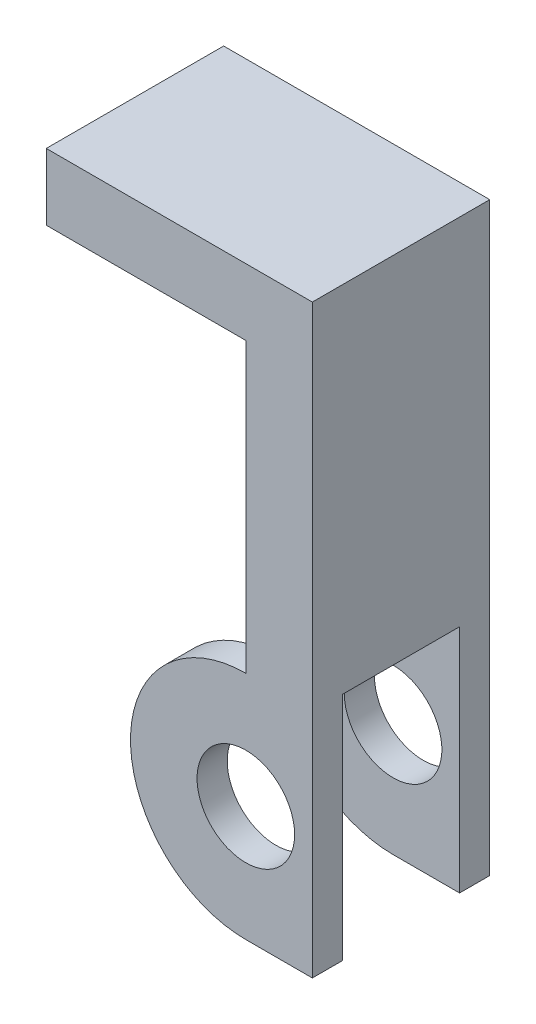
ISO-10303-21;
HEADER;
FILE_DESCRIPTION(('STEP AP214'),'2;1');
FILE_NAME('part.step','',(''),(''),'','','');
FILE_SCHEMA(('AUTOMOTIVE_DESIGN { 1 0 10303 214 1 1 1 1 }'));
ENDSEC;
DATA;
#1=APPLICATION_CONTEXT('core data for automotive mechanical design processes');
#2=APPLICATION_PROTOCOL_DEFINITION('international standard','automotive_design',2000,#1);
#3=PRODUCT_CONTEXT('',#1,'mechanical');
#4=PRODUCT('Part','Part','',(#3));
#5=PRODUCT_RELATED_PRODUCT_CATEGORY('part','',(#4));
#6=PRODUCT_DEFINITION_FORMATION('','',#4);
#7=PRODUCT_DEFINITION_CONTEXT('part definition',#1,'design');
#8=PRODUCT_DEFINITION('design','',#6,#7);
#9=PRODUCT_DEFINITION_SHAPE('','',#8);
#10=(LENGTH_UNIT() NAMED_UNIT(*) SI_UNIT(.MILLI.,.METRE.));
#11=(NAMED_UNIT(*) PLANE_ANGLE_UNIT() SI_UNIT($,.RADIAN.));
#12=(NAMED_UNIT(*) SI_UNIT($,.STERADIAN.) SOLID_ANGLE_UNIT());
#13=UNCERTAINTY_MEASURE_WITH_UNIT(LENGTH_MEASURE(1.E-05),#10,'distance_accuracy_value','');
#14=(GEOMETRIC_REPRESENTATION_CONTEXT(3) GLOBAL_UNCERTAINTY_ASSIGNED_CONTEXT((#13)) GLOBAL_UNIT_ASSIGNED_CONTEXT((#10,
#11,#12)) REPRESENTATION_CONTEXT('',''));
#15=CARTESIAN_POINT('',(0.,0.,0.));
#16=DIRECTION('',(0.,0.,1.));
#17=DIRECTION('',(1.,0.,0.));
#18=AXIS2_PLACEMENT_3D('',#15,#16,#17);
#19=CARTESIAN_POINT('',(-4.7625,-8.255,12.7));
#20=DIRECTION('',(0.,0.,-1.));
#21=DIRECTION('',(-1.,0.,0.));
#22=AXIS2_PLACEMENT_3D('',#19,#20,#21);
#23=CYLINDRICAL_SURFACE('',#22,8.255);
#24=DIRECTION('',(0.,0.,-1.));
#25=VECTOR('',#24,1.);
#26=CARTESIAN_POINT('',(-4.7625,-16.51,12.7));
#27=LINE('',#26,#25);
#28=CARTESIAN_POINT('',(-4.7625,-16.51,2.159));
#29=VERTEX_POINT('',#28);
#30=CARTESIAN_POINT('',(-4.7625,-16.51,0.));
#31=VERTEX_POINT('',#30);
#32=EDGE_CURVE('E162',#29,#31,#27,.T.);
#33=ORIENTED_EDGE('',*,*,#32,.F.);
#34=CARTESIAN_POINT('',(-4.7625,-8.255,2.159));
#35=DIRECTION('',(0.,0.,-1.));
#36=DIRECTION('',(-1.,0.,0.));
#37=AXIS2_PLACEMENT_3D('',#34,#35,#36);
#38=CIRCLE('',#37,8.255);
#39=CARTESIAN_POINT('',(-4.7625,0.,2.159));
#40=VERTEX_POINT('',#39);
#41=EDGE_CURVE('E186',#29,#40,#38,.T.);
#42=ORIENTED_EDGE('',*,*,#41,.T.);
#43=DIRECTION('',(0.,0.,-1.));
#44=VECTOR('',#43,1.);
#45=CARTESIAN_POINT('',(-4.7625,0.,12.7));
#46=LINE('',#45,#44);
#47=CARTESIAN_POINT('',(-4.7625,0.,0.));
#48=VERTEX_POINT('',#47);
#49=EDGE_CURVE('E134',#40,#48,#46,.T.);
#50=ORIENTED_EDGE('',*,*,#49,.T.);
#51=CARTESIAN_POINT('',(-4.7625,-8.255,0.));
#52=DIRECTION('',(0.,0.,1.));
#53=DIRECTION('',(1.,0.,0.));
#54=AXIS2_PLACEMENT_3D('',#51,#52,#53);
#55=CIRCLE('',#54,8.255);
#56=EDGE_CURVE('E153',#48,#31,#55,.T.);
#57=ORIENTED_EDGE('',*,*,#56,.T.);
#58=EDGE_LOOP('',(#33,#42,#50,#57));
#59=FACE_BOUND('',#58,.T.);
#60=ADVANCED_FACE('F33',(#59),#23,.T.);
#61=CARTESIAN_POINT('',(0.,-16.51,12.7));
#62=DIRECTION('',(0.,1.,0.));
#63=DIRECTION('',(0.,0.,1.));
#64=AXIS2_PLACEMENT_3D('',#61,#62,#63);
#65=PLANE('',#64);
#66=DIRECTION('',(0.,0.,-1.));
#67=VECTOR('',#66,1.);
#68=CARTESIAN_POINT('',(0.,-16.51,12.7));
#69=LINE('',#68,#67);
#70=CARTESIAN_POINT('',(0.,-16.51,2.159));
#71=VERTEX_POINT('',#70);
#72=CARTESIAN_POINT('',(0.,-16.51,0.));
#73=VERTEX_POINT('',#72);
#74=EDGE_CURVE('E89',#71,#73,#69,.T.);
#75=ORIENTED_EDGE('',*,*,#74,.F.);
#76=DIRECTION('',(1.,0.,0.));
#77=VECTOR('',#76,1.);
#78=CARTESIAN_POINT('',(0.,-16.51,2.159));
#79=LINE('',#78,#77);
#80=EDGE_CURVE('E183',#29,#71,#79,.T.);
#81=ORIENTED_EDGE('',*,*,#80,.F.);
#82=ORIENTED_EDGE('',*,*,#32,.T.);
#83=DIRECTION('',(1.,0.,0.));
#84=VECTOR('',#83,1.);
#85=CARTESIAN_POINT('',(0.,-16.51,0.));
#86=LINE('',#85,#84);
#87=EDGE_CURVE('E156',#31,#73,#86,.T.);
#88=ORIENTED_EDGE('',*,*,#87,.T.);
#89=EDGE_LOOP('',(#75,#81,#82,#88));
#90=FACE_BOUND('',#89,.T.);
#91=ADVANCED_FACE('F258',(#90),#65,.F.);
#92=CARTESIAN_POINT('',(-4.7625,-8.255,12.7));
#93=DIRECTION('',(0.,0.,-1.));
#94=DIRECTION('',(-1.,0.,0.));
#95=AXIS2_PLACEMENT_3D('',#92,#93,#94);
#96=CYLINDRICAL_SURFACE('',#95,3.4925);
#97=CARTESIAN_POINT('',(-4.7625,-8.255,2.159));
#98=DIRECTION('',(0.,0.,-1.));
#99=DIRECTION('',(-1.,0.,0.));
#100=AXIS2_PLACEMENT_3D('',#97,#98,#99);
#101=CIRCLE('',#100,3.4925);
#102=CARTESIAN_POINT('',(-8.255,-8.255,2.159));
#103=VERTEX_POINT('',#102);
#104=EDGE_CURVE('E37',#103,#103,#101,.T.);
#105=ORIENTED_EDGE('',*,*,#104,.F.);
#106=EDGE_LOOP('',(#105));
#107=FACE_BOUND('',#106,.T.);
#108=CARTESIAN_POINT('',(-4.7625,-8.255,0.));
#109=DIRECTION('',(0.,0.,1.));
#110=DIRECTION('',(1.,0.,0.));
#111=AXIS2_PLACEMENT_3D('',#108,#109,#110);
#112=CIRCLE('',#111,3.4925);
#113=CARTESIAN_POINT('',(-1.27,-8.255,0.));
#114=VERTEX_POINT('',#113);
#115=EDGE_CURVE('E189',#114,#114,#112,.T.);
#116=ORIENTED_EDGE('',*,*,#115,.F.);
#117=EDGE_LOOP('',(#116));
#118=FACE_BOUND('',#117,.T.);
#119=ADVANCED_FACE('F263',(#107,#118),#96,.F.);
#120=CARTESIAN_POINT('',(-4.7625,-8.255,12.7));
#121=DIRECTION('',(0.,0.,1.));
#122=DIRECTION('',(1.,0.,0.));
#123=AXIS2_PLACEMENT_3D('',#120,#121,#122);
#124=PLANE('',#123);
#125=DIRECTION('',(0.,1.,0.));
#126=VECTOR('',#125,1.);
#127=CARTESIAN_POINT('',(0.,0.,12.7));
#128=LINE('',#127,#126);
#129=CARTESIAN_POINT('',(0.,-16.51,12.7));
#130=VERTEX_POINT('',#129);
#131=CARTESIAN_POINT('',(0.,25.4,12.7));
#132=VERTEX_POINT('',#131);
#133=EDGE_CURVE('E95',#130,#132,#128,.T.);
#134=ORIENTED_EDGE('',*,*,#133,.T.);
#135=DIRECTION('',(-1.,0.,0.));
#136=VECTOR('',#135,1.);
#137=CARTESIAN_POINT('',(0.,25.4,12.7));
#138=LINE('',#137,#136);
#139=CARTESIAN_POINT('',(-19.05,25.4,12.7));
#140=VERTEX_POINT('',#139);
#141=EDGE_CURVE('E195',#132,#140,#138,.T.);
#142=ORIENTED_EDGE('',*,*,#141,.T.);
#143=DIRECTION('',(0.,-1.,0.));
#144=VECTOR('',#143,1.);
#145=CARTESIAN_POINT('',(-19.05,25.4,12.7));
#146=LINE('',#145,#144);
#147=CARTESIAN_POINT('',(-19.05,20.6375,12.7));
#148=VERTEX_POINT('',#147);
#149=EDGE_CURVE('E197',#140,#148,#146,.T.);
#150=ORIENTED_EDGE('',*,*,#149,.T.);
#151=DIRECTION('',(1.,0.,0.));
#152=VECTOR('',#151,1.);
#153=CARTESIAN_POINT('',(-19.05,20.6375,12.7));
#154=LINE('',#153,#152);
#155=CARTESIAN_POINT('',(-4.7625,20.6375,12.7));
#156=VERTEX_POINT('',#155);
#157=EDGE_CURVE('E116',#148,#156,#154,.T.);
#158=ORIENTED_EDGE('',*,*,#157,.T.);
#159=DIRECTION('',(0.,-1.,0.));
#160=VECTOR('',#159,1.);
#161=CARTESIAN_POINT('',(-4.7625,20.6375,12.7));
#162=LINE('',#161,#160);
#163=CARTESIAN_POINT('',(-4.7625,0.,12.7));
#164=VERTEX_POINT('',#163);
#165=EDGE_CURVE('E108',#156,#164,#162,.T.);
#166=ORIENTED_EDGE('',*,*,#165,.T.);
#167=CARTESIAN_POINT('',(-4.7625,-8.255,12.7));
#168=DIRECTION('',(0.,0.,1.));
#169=DIRECTION('',(1.,0.,0.));
#170=AXIS2_PLACEMENT_3D('',#167,#168,#169);
#171=CIRCLE('',#170,8.255);
#172=CARTESIAN_POINT('',(-4.7625,-16.51,12.7));
#173=VERTEX_POINT('',#172);
#174=EDGE_CURVE('E113',#164,#173,#171,.T.);
#175=ORIENTED_EDGE('',*,*,#174,.T.);
#176=DIRECTION('',(1.,0.,0.));
#177=VECTOR('',#176,1.);
#178=CARTESIAN_POINT('',(0.,-16.51,12.7));
#179=LINE('',#178,#177);
#180=EDGE_CURVE('E59',#173,#130,#179,.T.);
#181=ORIENTED_EDGE('',*,*,#180,.T.);
#182=EDGE_LOOP('',(#134,#142,#150,#158,#166,#175,#181));
#183=FACE_BOUND('',#182,.T.);
#184=CARTESIAN_POINT('',(-4.7625,-8.255,12.7));
#185=DIRECTION('',(0.,0.,1.));
#186=DIRECTION('',(1.,0.,0.));
#187=AXIS2_PLACEMENT_3D('',#184,#185,#186);
#188=CIRCLE('',#187,3.4925);
#189=CARTESIAN_POINT('',(-1.27,-8.255,12.7));
#190=VERTEX_POINT('',#189);
#191=EDGE_CURVE('E145',#190,#190,#188,.T.);
#192=ORIENTED_EDGE('',*,*,#191,.F.);
#193=EDGE_LOOP('',(#192));
#194=FACE_BOUND('',#193,.T.);
#195=ADVANCED_FACE('F110',(#183,#194),#124,.T.);
#196=CARTESIAN_POINT('',(-4.7625,-8.255,0.));
#197=DIRECTION('',(0.,0.,1.));
#198=DIRECTION('',(1.,0.,0.));
#199=AXIS2_PLACEMENT_3D('',#196,#197,#198);
#200=PLANE('',#199);
#201=DIRECTION('',(0.,1.,0.));
#202=VECTOR('',#201,1.);
#203=CARTESIAN_POINT('',(0.,0.,0.));
#204=LINE('',#203,#202);
#205=CARTESIAN_POINT('',(0.,25.4,0.));
#206=VERTEX_POINT('',#205);
#207=EDGE_CURVE('E142',#73,#206,#204,.T.);
#208=ORIENTED_EDGE('',*,*,#207,.F.);
#209=ORIENTED_EDGE('',*,*,#87,.F.);
#210=ORIENTED_EDGE('',*,*,#56,.F.);
#211=DIRECTION('',(0.,-1.,0.));
#212=VECTOR('',#211,1.);
#213=CARTESIAN_POINT('',(-4.7625,20.6375,0.));
#214=LINE('',#213,#212);
#215=CARTESIAN_POINT('',(-4.7625,20.6375,0.));
#216=VERTEX_POINT('',#215);
#217=EDGE_CURVE('E151',#216,#48,#214,.T.);
#218=ORIENTED_EDGE('',*,*,#217,.F.);
#219=DIRECTION('',(1.,0.,0.));
#220=VECTOR('',#219,1.);
#221=CARTESIAN_POINT('',(-19.05,20.6375,0.));
#222=LINE('',#221,#220);
#223=CARTESIAN_POINT('',(-19.05,20.6375,0.));
#224=VERTEX_POINT('',#223);
#225=EDGE_CURVE('E149',#224,#216,#222,.T.);
#226=ORIENTED_EDGE('',*,*,#225,.F.);
#227=DIRECTION('',(0.,-1.,0.));
#228=VECTOR('',#227,1.);
#229=CARTESIAN_POINT('',(-19.05,25.4,0.));
#230=LINE('',#229,#228);
#231=CARTESIAN_POINT('',(-19.05,25.4,0.));
#232=VERTEX_POINT('',#231);
#233=EDGE_CURVE('E147',#232,#224,#230,.T.);
#234=ORIENTED_EDGE('',*,*,#233,.F.);
#235=DIRECTION('',(-1.,0.,0.));
#236=VECTOR('',#235,1.);
#237=CARTESIAN_POINT('',(0.,25.4,0.));
#238=LINE('',#237,#236);
#239=EDGE_CURVE('E144',#206,#232,#238,.T.);
#240=ORIENTED_EDGE('',*,*,#239,.F.);
#241=EDGE_LOOP('',(#208,#209,#210,#218,#226,#234,#240));
#242=FACE_BOUND('',#241,.T.);
#243=ORIENTED_EDGE('',*,*,#115,.T.);
#244=EDGE_LOOP('',(#243));
#245=FACE_BOUND('',#244,.T.);
#246=ADVANCED_FACE('F211',(#242,#245),#200,.F.);
#247=CARTESIAN_POINT('',(0.,0.,12.7));
#248=DIRECTION('',(-1.,0.,0.));
#249=DIRECTION('',(0.,0.,1.));
#250=AXIS2_PLACEMENT_3D('',#247,#248,#249);
#251=PLANE('',#250);
#252=DIRECTION('',(0.,0.,1.));
#253=VECTOR('',#252,1.);
#254=CARTESIAN_POINT('',(0.,0.,10.541));
#255=LINE('',#254,#253);
#256=CARTESIAN_POINT('',(0.,0.,2.159));
#257=VERTEX_POINT('',#256);
#258=CARTESIAN_POINT('',(0.,0.,10.541));
#259=VERTEX_POINT('',#258);
#260=EDGE_CURVE('E231',#257,#259,#255,.T.);
#261=ORIENTED_EDGE('',*,*,#260,.F.);
#262=DIRECTION('',(0.,-1.,0.));
#263=VECTOR('',#262,1.);
#264=CARTESIAN_POINT('',(0.,0.,2.159));
#265=LINE('',#264,#263);
#266=EDGE_CURVE('E172',#257,#71,#265,.T.);
#267=ORIENTED_EDGE('',*,*,#266,.T.);
#268=ORIENTED_EDGE('',*,*,#74,.T.);
#269=ORIENTED_EDGE('',*,*,#207,.T.);
#270=DIRECTION('',(0.,0.,-1.));
#271=VECTOR('',#270,1.);
#272=CARTESIAN_POINT('',(0.,25.4,12.7));
#273=LINE('',#272,#271);
#274=EDGE_CURVE('E11',#132,#206,#273,.T.);
#275=ORIENTED_EDGE('',*,*,#274,.F.);
#276=ORIENTED_EDGE('',*,*,#133,.F.);
#277=CARTESIAN_POINT('',(0.,-16.51,10.541));
#278=VERTEX_POINT('',#277);
#279=EDGE_CURVE('E159',#130,#278,#69,.T.);
#280=ORIENTED_EDGE('',*,*,#279,.T.);
#281=DIRECTION('',(0.,-1.,0.));
#282=VECTOR('',#281,1.);
#283=CARTESIAN_POINT('',(0.,0.,10.541));
#284=LINE('',#283,#282);
#285=EDGE_CURVE('E50',#259,#278,#284,.T.);
#286=ORIENTED_EDGE('',*,*,#285,.F.);
#287=EDGE_LOOP('',(#261,#267,#268,#269,#275,#276,#280,#286));
#288=FACE_BOUND('',#287,.T.);
#289=ADVANCED_FACE('F35',(#288),#251,.F.);
#290=CARTESIAN_POINT('',(0.,25.4,12.7));
#291=DIRECTION('',(0.,-1.,0.));
#292=DIRECTION('',(1.,0.,0.));
#293=AXIS2_PLACEMENT_3D('',#290,#291,#292);
#294=PLANE('',#293);
#295=ORIENTED_EDGE('',*,*,#239,.T.);
#296=DIRECTION('',(0.,0.,-1.));
#297=VECTOR('',#296,1.);
#298=CARTESIAN_POINT('',(-19.05,25.4,12.7));
#299=LINE('',#298,#297);
#300=EDGE_CURVE('E42',#140,#232,#299,.T.);
#301=ORIENTED_EDGE('',*,*,#300,.F.);
#302=ORIENTED_EDGE('',*,*,#141,.F.);
#303=ORIENTED_EDGE('',*,*,#274,.T.);
#304=EDGE_LOOP('',(#295,#301,#302,#303));
#305=FACE_BOUND('',#304,.T.);
#306=ADVANCED_FACE('F278',(#305),#294,.F.);
#307=CARTESIAN_POINT('',(-19.05,25.4,12.7));
#308=DIRECTION('',(1.,0.,0.));
#309=DIRECTION('',(0.,0.,-1.));
#310=AXIS2_PLACEMENT_3D('',#307,#308,#309);
#311=PLANE('',#310);
#312=ORIENTED_EDGE('',*,*,#233,.T.);
#313=DIRECTION('',(0.,0.,-1.));
#314=VECTOR('',#313,1.);
#315=CARTESIAN_POINT('',(-19.05,20.6375,12.7));
#316=LINE('',#315,#314);
#317=EDGE_CURVE('E165',#148,#224,#316,.T.);
#318=ORIENTED_EDGE('',*,*,#317,.F.);
#319=ORIENTED_EDGE('',*,*,#149,.F.);
#320=ORIENTED_EDGE('',*,*,#300,.T.);
#321=EDGE_LOOP('',(#312,#318,#319,#320));
#322=FACE_BOUND('',#321,.T.);
#323=ADVANCED_FACE('F203',(#322),#311,.F.);
#324=CARTESIAN_POINT('',(-19.05,20.6375,12.7));
#325=DIRECTION('',(0.,1.,0.));
#326=DIRECTION('',(-1.,0.,0.));
#327=AXIS2_PLACEMENT_3D('',#324,#325,#326);
#328=PLANE('',#327);
#329=ORIENTED_EDGE('',*,*,#225,.T.);
#330=DIRECTION('',(0.,0.,-1.));
#331=VECTOR('',#330,1.);
#332=CARTESIAN_POINT('',(-4.7625,20.6375,12.7));
#333=LINE('',#332,#331);
#334=EDGE_CURVE('E132',#156,#216,#333,.T.);
#335=ORIENTED_EDGE('',*,*,#334,.F.);
#336=ORIENTED_EDGE('',*,*,#157,.F.);
#337=ORIENTED_EDGE('',*,*,#317,.T.);
#338=EDGE_LOOP('',(#329,#335,#336,#337));
#339=FACE_BOUND('',#338,.T.);
#340=ADVANCED_FACE('F207',(#339),#328,.F.);
#341=CARTESIAN_POINT('',(-4.7625,20.6375,12.7));
#342=DIRECTION('',(1.,0.,0.));
#343=DIRECTION('',(0.,1.,0.));
#344=AXIS2_PLACEMENT_3D('',#341,#342,#343);
#345=PLANE('',#344);
#346=ORIENTED_EDGE('',*,*,#217,.T.);
#347=ORIENTED_EDGE('',*,*,#49,.F.);
#348=CARTESIAN_POINT('',(-4.7625,0.,10.541));
#349=VERTEX_POINT('',#348);
#350=EDGE_CURVE('E129',#349,#40,#46,.T.);
#351=ORIENTED_EDGE('',*,*,#350,.F.);
#352=EDGE_CURVE('E123',#164,#349,#46,.T.);
#353=ORIENTED_EDGE('',*,*,#352,.F.);
#354=ORIENTED_EDGE('',*,*,#165,.F.);
#355=ORIENTED_EDGE('',*,*,#334,.T.);
#356=EDGE_LOOP('',(#346,#347,#351,#353,#354,#355));
#357=FACE_BOUND('',#356,.T.);
#358=ADVANCED_FACE('F125',(#357),#345,.F.);
#359=ORIENTED_EDGE('',*,*,#352,.T.);
#360=CARTESIAN_POINT('',(-4.7625,-8.255,10.541));
#361=DIRECTION('',(0.,0.,1.));
#362=DIRECTION('',(1.,0.,0.));
#363=AXIS2_PLACEMENT_3D('',#360,#361,#362);
#364=CIRCLE('',#363,8.255);
#365=CARTESIAN_POINT('',(-4.7625,-16.51,10.541));
#366=VERTEX_POINT('',#365);
#367=EDGE_CURVE('E171',#349,#366,#364,.T.);
#368=ORIENTED_EDGE('',*,*,#367,.T.);
#369=EDGE_CURVE('E137',#173,#366,#27,.T.);
#370=ORIENTED_EDGE('',*,*,#369,.F.);
#371=ORIENTED_EDGE('',*,*,#174,.F.);
#372=EDGE_LOOP('',(#359,#368,#370,#371));
#373=FACE_BOUND('',#372,.T.);
#374=ADVANCED_FACE('F135',(#373),#23,.T.);
#375=ORIENTED_EDGE('',*,*,#369,.T.);
#376=DIRECTION('',(-1.,0.,0.));
#377=VECTOR('',#376,1.);
#378=CARTESIAN_POINT('',(0.,-16.51,10.541));
#379=LINE('',#378,#377);
#380=EDGE_CURVE('E234',#278,#366,#379,.T.);
#381=ORIENTED_EDGE('',*,*,#380,.F.);
#382=ORIENTED_EDGE('',*,*,#279,.F.);
#383=ORIENTED_EDGE('',*,*,#180,.F.);
#384=EDGE_LOOP('',(#375,#381,#382,#383));
#385=FACE_BOUND('',#384,.T.);
#386=ADVANCED_FACE('F240',(#385),#65,.F.);
#387=CARTESIAN_POINT('',(-4.7625,-8.255,10.541));
#388=DIRECTION('',(0.,0.,1.));
#389=DIRECTION('',(1.,0.,0.));
#390=AXIS2_PLACEMENT_3D('',#387,#388,#389);
#391=CIRCLE('',#390,3.4925);
#392=CARTESIAN_POINT('',(-1.27,-8.255,10.541));
#393=VERTEX_POINT('',#392);
#394=EDGE_CURVE('E169',#393,#393,#391,.T.);
#395=ORIENTED_EDGE('',*,*,#394,.F.);
#396=EDGE_LOOP('',(#395));
#397=FACE_BOUND('',#396,.T.);
#398=ORIENTED_EDGE('',*,*,#191,.T.);
#399=EDGE_LOOP('',(#398));
#400=FACE_BOUND('',#399,.T.);
#401=ADVANCED_FACE('F253',(#397,#400),#96,.F.);
#402=CARTESIAN_POINT('',(0.,0.,2.159));
#403=DIRECTION('',(0.,0.,-1.));
#404=DIRECTION('',(-1.,0.,0.));
#405=AXIS2_PLACEMENT_3D('',#402,#403,#404);
#406=PLANE('',#405);
#407=ORIENTED_EDGE('',*,*,#104,.T.);
#408=EDGE_LOOP('',(#407));
#409=FACE_BOUND('',#408,.T.);
#410=ORIENTED_EDGE('',*,*,#80,.T.);
#411=ORIENTED_EDGE('',*,*,#266,.F.);
#412=DIRECTION('',(1.,0.,0.));
#413=VECTOR('',#412,1.);
#414=CARTESIAN_POINT('',(0.,0.,2.159));
#415=LINE('',#414,#413);
#416=EDGE_CURVE('E180',#40,#257,#415,.T.);
#417=ORIENTED_EDGE('',*,*,#416,.F.);
#418=ORIENTED_EDGE('',*,*,#41,.F.);
#419=EDGE_LOOP('',(#410,#411,#417,#418));
#420=FACE_BOUND('',#419,.T.);
#421=ADVANCED_FACE('F228',(#409,#420),#406,.F.);
#422=CARTESIAN_POINT('',(0.,0.,10.541));
#423=DIRECTION('',(0.,0.,1.));
#424=DIRECTION('',(1.,0.,0.));
#425=AXIS2_PLACEMENT_3D('',#422,#423,#424);
#426=PLANE('',#425);
#427=ORIENTED_EDGE('',*,*,#394,.T.);
#428=EDGE_LOOP('',(#427));
#429=FACE_BOUND('',#428,.T.);
#430=DIRECTION('',(-1.,0.,0.));
#431=VECTOR('',#430,1.);
#432=CARTESIAN_POINT('',(0.,0.,10.541));
#433=LINE('',#432,#431);
#434=EDGE_CURVE('E225',#259,#349,#433,.T.);
#435=ORIENTED_EDGE('',*,*,#434,.F.);
#436=ORIENTED_EDGE('',*,*,#285,.T.);
#437=ORIENTED_EDGE('',*,*,#380,.T.);
#438=ORIENTED_EDGE('',*,*,#367,.F.);
#439=EDGE_LOOP('',(#435,#436,#437,#438));
#440=FACE_BOUND('',#439,.T.);
#441=ADVANCED_FACE('F245',(#429,#440),#426,.F.);
#442=CARTESIAN_POINT('',(0.,0.,0.));
#443=DIRECTION('',(0.,1.,0.));
#444=DIRECTION('',(0.,0.,1.));
#445=AXIS2_PLACEMENT_3D('',#442,#443,#444);
#446=PLANE('',#445);
#447=ORIENTED_EDGE('',*,*,#350,.T.);
#448=ORIENTED_EDGE('',*,*,#416,.T.);
#449=ORIENTED_EDGE('',*,*,#260,.T.);
#450=ORIENTED_EDGE('',*,*,#434,.T.);
#451=EDGE_LOOP('',(#447,#448,#449,#450));
#452=FACE_BOUND('',#451,.T.);
#453=ADVANCED_FACE('F222',(#452),#446,.F.);
#454=CLOSED_SHELL('',(#60,#91,#119,#195,#246,#289,#306,#323,#340,#358,#374,#386,#401,#421,#441,#453));
#455=MANIFOLD_SOLID_BREP('B2',#454);
#456=ADVANCED_BREP_SHAPE_REPRESENTATION('',(#18,#455),#14);
#457=SHAPE_DEFINITION_REPRESENTATION(#9,#456);
ENDSEC;
END-ISO-10303-21;
